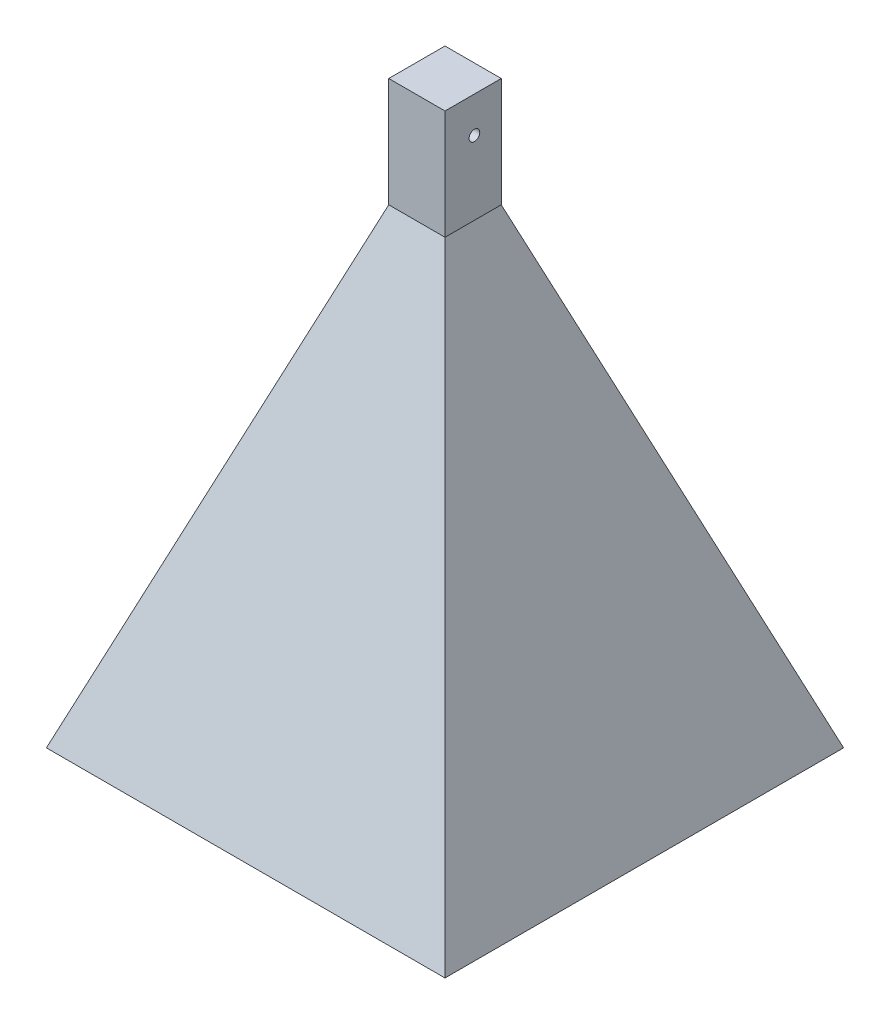
ISO-10303-21;
HEADER;
FILE_DESCRIPTION(('STEP AP214'),'2;1');
FILE_NAME('part.step','',(''),(''),'','','');
FILE_SCHEMA(('AUTOMOTIVE_DESIGN { 1 0 10303 214 1 1 1 1 }'));
ENDSEC;
DATA;
#1=APPLICATION_CONTEXT('core data for automotive mechanical design processes');
#2=APPLICATION_PROTOCOL_DEFINITION('international standard','automotive_design',2000,#1);
#3=PRODUCT_CONTEXT('',#1,'mechanical');
#4=PRODUCT('Part','Part','',(#3));
#5=PRODUCT_RELATED_PRODUCT_CATEGORY('part','',(#4));
#6=PRODUCT_DEFINITION_FORMATION('','',#4);
#7=PRODUCT_DEFINITION_CONTEXT('part definition',#1,'design');
#8=PRODUCT_DEFINITION('design','',#6,#7);
#9=PRODUCT_DEFINITION_SHAPE('','',#8);
#10=(LENGTH_UNIT() NAMED_UNIT(*) SI_UNIT(.MILLI.,.METRE.));
#11=(NAMED_UNIT(*) PLANE_ANGLE_UNIT() SI_UNIT($,.RADIAN.));
#12=(NAMED_UNIT(*) SI_UNIT($,.STERADIAN.) SOLID_ANGLE_UNIT());
#13=UNCERTAINTY_MEASURE_WITH_UNIT(LENGTH_MEASURE(1.E-05),#10,'distance_accuracy_value','');
#14=(GEOMETRIC_REPRESENTATION_CONTEXT(3) GLOBAL_UNCERTAINTY_ASSIGNED_CONTEXT((#13)) GLOBAL_UNIT_ASSIGNED_CONTEXT((#10,
#11,#12)) REPRESENTATION_CONTEXT('',''));
#15=CARTESIAN_POINT('',(0.,0.,0.));
#16=DIRECTION('',(0.,0.,1.));
#17=DIRECTION('',(1.,0.,0.));
#18=AXIS2_PLACEMENT_3D('',#15,#16,#17);
#19=CARTESIAN_POINT('',(-52.5,-500000.,52.5));
#20=DIRECTION('',(0.,0.,1.));
#21=DIRECTION('',(1.,0.,0.));
#22=AXIS2_PLACEMENT_3D('',#19,#20,#21);
#23=PLANE('',#22);
#24=DIRECTION('',(0.,1.,0.));
#25=VECTOR('',#24,1.);
#26=CARTESIAN_POINT('',(-52.5,-500000.,52.5));
#27=LINE('',#26,#25);
#28=CARTESIAN_POINT('',(-52.4999999999999,877.81903551575,52.5));
#29=VERTEX_POINT('',#28);
#30=CARTESIAN_POINT('',(-52.5,1082.,52.5));
#31=VERTEX_POINT('',#30);
#32=EDGE_CURVE('E70',#29,#31,#27,.T.);
#33=ORIENTED_EDGE('',*,*,#32,.F.);
#34=DIRECTION('',(-1.,0.,0.));
#35=VECTOR('',#34,1.);
#36=CARTESIAN_POINT('',(-52.5,877.819035515756,52.5));
#37=LINE('',#36,#35);
#38=CARTESIAN_POINT('',(52.5,877.819035515756,52.5));
#39=VERTEX_POINT('',#38);
#40=EDGE_CURVE('E216',#29,#39,#37,.F.);
#41=ORIENTED_EDGE('',*,*,#40,.T.);
#42=DIRECTION('',(0.,1.,0.));
#43=VECTOR('',#42,1.);
#44=CARTESIAN_POINT('',(52.5,-500000.,52.5));
#45=LINE('',#44,#43);
#46=CARTESIAN_POINT('',(52.5,1082.,52.5));
#47=VERTEX_POINT('',#46);
#48=EDGE_CURVE('E224',#39,#47,#45,.T.);
#49=ORIENTED_EDGE('',*,*,#48,.T.);
#50=DIRECTION('',(1.,0.,0.));
#51=VECTOR('',#50,1.);
#52=CARTESIAN_POINT('',(-52.5,1082.,52.5));
#53=LINE('',#52,#51);
#54=EDGE_CURVE('E208',#31,#47,#53,.T.);
#55=ORIENTED_EDGE('',*,*,#54,.F.);
#56=EDGE_LOOP('',(#33,#41,#49,#55));
#57=FACE_BOUND('',#56,.T.);
#58=ADVANCED_FACE('F45',(#57),#23,.T.);
#59=CARTESIAN_POINT('',(-52.5,-500000.,52.5));
#60=DIRECTION('',(-1.,0.,0.));
#61=DIRECTION('',(0.,0.,1.));
#62=AXIS2_PLACEMENT_3D('',#59,#60,#61);
#63=PLANE('',#62);
#64=DIRECTION('',(0.,1.,0.));
#65=VECTOR('',#64,1.);
#66=CARTESIAN_POINT('',(-52.5,-500000.,-52.5));
#67=LINE('',#66,#65);
#68=CARTESIAN_POINT('',(-52.5,877.819035515756,-52.5));
#69=VERTEX_POINT('',#68);
#70=CARTESIAN_POINT('',(-52.5,1082.,-52.5));
#71=VERTEX_POINT('',#70);
#72=EDGE_CURVE('E221',#69,#71,#67,.T.);
#73=ORIENTED_EDGE('',*,*,#72,.F.);
#74=DIRECTION('',(0.,0.,-1.));
#75=VECTOR('',#74,1.);
#76=CARTESIAN_POINT('',(-52.5,877.819035515756,52.5));
#77=LINE('',#76,#75);
#78=EDGE_CURVE('E215',#69,#29,#77,.F.);
#79=ORIENTED_EDGE('',*,*,#78,.T.);
#80=ORIENTED_EDGE('',*,*,#32,.T.);
#81=DIRECTION('',(0.,0.,1.));
#82=VECTOR('',#81,1.);
#83=CARTESIAN_POINT('',(-52.5,1082.,52.5));
#84=LINE('',#83,#82);
#85=EDGE_CURVE('E205',#71,#31,#84,.T.);
#86=ORIENTED_EDGE('',*,*,#85,.F.);
#87=EDGE_LOOP('',(#73,#79,#80,#86));
#88=FACE_BOUND('',#87,.T.);
#89=ADVANCED_FACE('F285',(#88),#63,.T.);
#90=CARTESIAN_POINT('',(-52.5,-500000.,-52.5));
#91=DIRECTION('',(0.,0.,-1.));
#92=DIRECTION('',(-1.,0.,0.));
#93=AXIS2_PLACEMENT_3D('',#90,#91,#92);
#94=PLANE('',#93);
#95=DIRECTION('',(0.,1.,0.));
#96=VECTOR('',#95,1.);
#97=CARTESIAN_POINT('',(52.5,-500000.,-52.5));
#98=LINE('',#97,#96);
#99=CARTESIAN_POINT('',(52.5,877.819035515756,-52.5));
#100=VERTEX_POINT('',#99);
#101=CARTESIAN_POINT('',(52.5,1082.,-52.5));
#102=VERTEX_POINT('',#101);
#103=EDGE_CURVE('E218',#100,#102,#98,.T.);
#104=ORIENTED_EDGE('',*,*,#103,.F.);
#105=DIRECTION('',(1.,0.,0.));
#106=VECTOR('',#105,1.);
#107=CARTESIAN_POINT('',(-52.5,877.819035515756,-52.5));
#108=LINE('',#107,#106);
#109=EDGE_CURVE('E213',#100,#69,#108,.F.);
#110=ORIENTED_EDGE('',*,*,#109,.T.);
#111=ORIENTED_EDGE('',*,*,#72,.T.);
#112=DIRECTION('',(-1.,0.,0.));
#113=VECTOR('',#112,1.);
#114=CARTESIAN_POINT('',(-52.5,1082.,-52.5));
#115=LINE('',#114,#113);
#116=EDGE_CURVE('E202',#102,#71,#115,.T.);
#117=ORIENTED_EDGE('',*,*,#116,.F.);
#118=EDGE_LOOP('',(#104,#110,#111,#117));
#119=FACE_BOUND('',#118,.T.);
#120=ADVANCED_FACE('F279',(#119),#94,.T.);
#121=CARTESIAN_POINT('',(52.5,-500000.,52.5));
#122=DIRECTION('',(1.,0.,0.));
#123=DIRECTION('',(0.,0.,-1.));
#124=AXIS2_PLACEMENT_3D('',#121,#122,#123);
#125=PLANE('',#124);
#126=CARTESIAN_POINT('',(52.5,1015.,-2.39055159684673));
#127=DIRECTION('',(1.,0.,0.));
#128=DIRECTION('',(0.,0.,-1.));
#129=AXIS2_PLACEMENT_3D('',#126,#127,#128);
#130=CIRCLE('',#129,10.);
#131=CARTESIAN_POINT('',(52.5,1015.,-12.3905515968467));
#132=VERTEX_POINT('',#131);
#133=EDGE_CURVE('E163',#132,#132,#130,.T.);
#134=ORIENTED_EDGE('',*,*,#133,.F.);
#135=EDGE_LOOP('',(#134));
#136=FACE_BOUND('',#135,.T.);
#137=ORIENTED_EDGE('',*,*,#48,.F.);
#138=DIRECTION('',(0.,0.,1.));
#139=VECTOR('',#138,1.);
#140=CARTESIAN_POINT('',(52.5,877.819035515756,52.5));
#141=LINE('',#140,#139);
#142=EDGE_CURVE('E211',#39,#100,#141,.F.);
#143=ORIENTED_EDGE('',*,*,#142,.T.);
#144=ORIENTED_EDGE('',*,*,#103,.T.);
#145=DIRECTION('',(0.,0.,-1.));
#146=VECTOR('',#145,1.);
#147=CARTESIAN_POINT('',(52.5,1082.,52.5));
#148=LINE('',#147,#146);
#149=EDGE_CURVE('E186',#47,#102,#148,.T.);
#150=ORIENTED_EDGE('',*,*,#149,.F.);
#151=EDGE_LOOP('',(#137,#143,#144,#150));
#152=FACE_BOUND('',#151,.T.);
#153=ADVANCED_FACE('F263',(#136,#152),#125,.T.);
#154=CARTESIAN_POINT('',(0.,1082.,0.));
#155=DIRECTION('',(0.,-1.,0.));
#156=DIRECTION('',(0.,0.,-1.));
#157=AXIS2_PLACEMENT_3D('',#154,#155,#156);
#158=PLANE('',#157);
#159=ORIENTED_EDGE('',*,*,#149,.T.);
#160=ORIENTED_EDGE('',*,*,#116,.T.);
#161=ORIENTED_EDGE('',*,*,#85,.T.);
#162=ORIENTED_EDGE('',*,*,#54,.T.);
#163=EDGE_LOOP('',(#159,#160,#161,#162));
#164=FACE_BOUND('',#163,.T.);
#165=ADVANCED_FACE('F268',(#164),#158,.F.);
#166=CARTESIAN_POINT('',(372.,0.,372.));
#167=DIRECTION('',(0.939692620785908,0.342020143325669,0.));
#168=DIRECTION('',(-0.342020143325669,0.939692620785908,0.));
#169=AXIS2_PLACEMENT_3D('',#166,#167,#168);
#170=PLANE('',#169);
#171=DIRECTION('',(0.323615577118185,-0.889126490715988,-0.323615577118185));
#172=VECTOR('',#171,1.);
#173=CARTESIAN_POINT('',(294.083080935369,214.074975723546,-294.083080935369));
#174=LINE('',#173,#172);
#175=CARTESIAN_POINT('',(372.,0.,-372.));
#176=VERTEX_POINT('',#175);
#177=EDGE_CURVE('E13',#100,#176,#174,.T.);
#178=ORIENTED_EDGE('',*,*,#177,.F.);
#179=ORIENTED_EDGE('',*,*,#142,.F.);
#180=DIRECTION('',(0.323615577118185,-0.889126490715988,0.323615577118185));
#181=VECTOR('',#180,1.);
#182=CARTESIAN_POINT('',(372.,0.,372.));
#183=LINE('',#182,#181);
#184=CARTESIAN_POINT('',(372.,0.,372.));
#185=VERTEX_POINT('',#184);
#186=EDGE_CURVE('E237',#39,#185,#183,.T.);
#187=ORIENTED_EDGE('',*,*,#186,.T.);
#188=DIRECTION('',(0.,0.,-1.));
#189=VECTOR('',#188,1.);
#190=CARTESIAN_POINT('',(372.,0.,372.));
#191=LINE('',#190,#189);
#192=EDGE_CURVE('E226',#185,#176,#191,.T.);
#193=ORIENTED_EDGE('',*,*,#192,.T.);
#194=EDGE_LOOP('',(#178,#179,#187,#193));
#195=FACE_BOUND('',#194,.T.);
#196=ADVANCED_FACE('F266',(#195),#170,.T.);
#197=CARTESIAN_POINT('',(-372.,0.,-372.));
#198=DIRECTION('',(0.,0.342020143325669,-0.939692620785908));
#199=DIRECTION('',(0.,0.939692620785908,0.342020143325669));
#200=AXIS2_PLACEMENT_3D('',#197,#198,#199);
#201=PLANE('',#200);
#202=DIRECTION('',(-0.323615577118185,-0.889126490715988,-0.323615577118185));
#203=VECTOR('',#202,1.);
#204=CARTESIAN_POINT('',(-294.083080935369,214.074975723546,-294.083080935369));
#205=LINE('',#204,#203);
#206=CARTESIAN_POINT('',(-372.,0.,-372.));
#207=VERTEX_POINT('',#206);
#208=EDGE_CURVE('E54',#69,#207,#205,.T.);
#209=ORIENTED_EDGE('',*,*,#208,.F.);
#210=ORIENTED_EDGE('',*,*,#109,.F.);
#211=ORIENTED_EDGE('',*,*,#177,.T.);
#212=DIRECTION('',(-1.,0.,0.));
#213=VECTOR('',#212,1.);
#214=CARTESIAN_POINT('',(-372.,0.,-372.));
#215=LINE('',#214,#213);
#216=EDGE_CURVE('E229',#176,#207,#215,.T.);
#217=ORIENTED_EDGE('',*,*,#216,.T.);
#218=EDGE_LOOP('',(#209,#210,#211,#217));
#219=FACE_BOUND('',#218,.T.);
#220=ADVANCED_FACE('F47',(#219),#201,.T.);
#221=CARTESIAN_POINT('',(-372.,0.,372.));
#222=DIRECTION('',(-0.939692620785908,0.342020143325669,0.));
#223=DIRECTION('',(-0.342020143325669,-0.939692620785908,0.));
#224=AXIS2_PLACEMENT_3D('',#221,#222,#223);
#225=PLANE('',#224);
#226=DIRECTION('',(-0.323615577118185,-0.889126490715988,0.323615577118185));
#227=VECTOR('',#226,1.);
#228=CARTESIAN_POINT('',(-372.,0.,372.));
#229=LINE('',#228,#227);
#230=CARTESIAN_POINT('',(-372.,0.,372.));
#231=VERTEX_POINT('',#230);
#232=EDGE_CURVE('E240',#29,#231,#229,.T.);
#233=ORIENTED_EDGE('',*,*,#232,.F.);
#234=ORIENTED_EDGE('',*,*,#78,.F.);
#235=ORIENTED_EDGE('',*,*,#208,.T.);
#236=DIRECTION('',(0.,0.,1.));
#237=VECTOR('',#236,1.);
#238=CARTESIAN_POINT('',(-372.,0.,372.));
#239=LINE('',#238,#237);
#240=EDGE_CURVE('E232',#207,#231,#239,.T.);
#241=ORIENTED_EDGE('',*,*,#240,.T.);
#242=EDGE_LOOP('',(#233,#234,#235,#241));
#243=FACE_BOUND('',#242,.T.);
#244=ADVANCED_FACE('F245',(#243),#225,.T.);
#245=CARTESIAN_POINT('',(-372.,0.,372.));
#246=DIRECTION('',(0.,0.342020143325669,0.939692620785908));
#247=DIRECTION('',(0.,-0.939692620785908,0.342020143325669));
#248=AXIS2_PLACEMENT_3D('',#245,#246,#247);
#249=PLANE('',#248);
#250=ORIENTED_EDGE('',*,*,#186,.F.);
#251=ORIENTED_EDGE('',*,*,#40,.F.);
#252=ORIENTED_EDGE('',*,*,#232,.T.);
#253=DIRECTION('',(1.,0.,0.));
#254=VECTOR('',#253,1.);
#255=CARTESIAN_POINT('',(-372.,0.,372.));
#256=LINE('',#255,#254);
#257=EDGE_CURVE('E235',#231,#185,#256,.T.);
#258=ORIENTED_EDGE('',*,*,#257,.T.);
#259=EDGE_LOOP('',(#250,#251,#252,#258));
#260=FACE_BOUND('',#259,.T.);
#261=ADVANCED_FACE('F257',(#260),#249,.T.);
#262=CARTESIAN_POINT('',(0.,0.,0.));
#263=DIRECTION('',(0.,-1.,0.));
#264=DIRECTION('',(0.,0.,-1.));
#265=AXIS2_PLACEMENT_3D('',#262,#263,#264);
#266=PLANE('',#265);
#267=DIRECTION('',(1.,0.,0.));
#268=VECTOR('',#267,1.);
#269=CARTESIAN_POINT('',(-342.,0.,-342.));
#270=LINE('',#269,#268);
#271=CARTESIAN_POINT('',(-342.,0.,-342.));
#272=VERTEX_POINT('',#271);
#273=CARTESIAN_POINT('',(342.,0.,-342.));
#274=VERTEX_POINT('',#273);
#275=EDGE_CURVE('E62',#272,#274,#270,.T.);
#276=ORIENTED_EDGE('',*,*,#275,.F.);
#277=DIRECTION('',(0.,0.,-1.));
#278=VECTOR('',#277,1.);
#279=CARTESIAN_POINT('',(-342.,0.,342.));
#280=LINE('',#279,#278);
#281=CARTESIAN_POINT('',(-342.,0.,342.));
#282=VERTEX_POINT('',#281);
#283=EDGE_CURVE('E180',#282,#272,#280,.T.);
#284=ORIENTED_EDGE('',*,*,#283,.F.);
#285=DIRECTION('',(-1.,0.,0.));
#286=VECTOR('',#285,1.);
#287=CARTESIAN_POINT('',(342.,0.,342.));
#288=LINE('',#287,#286);
#289=CARTESIAN_POINT('',(342.,0.,342.));
#290=VERTEX_POINT('',#289);
#291=EDGE_CURVE('E177',#290,#282,#288,.T.);
#292=ORIENTED_EDGE('',*,*,#291,.F.);
#293=DIRECTION('',(0.,0.,1.));
#294=VECTOR('',#293,1.);
#295=CARTESIAN_POINT('',(342.,0.,-342.));
#296=LINE('',#295,#294);
#297=EDGE_CURVE('E174',#274,#290,#296,.T.);
#298=ORIENTED_EDGE('',*,*,#297,.F.);
#299=EDGE_LOOP('',(#276,#284,#292,#298));
#300=FACE_BOUND('',#299,.T.);
#301=ORIENTED_EDGE('',*,*,#192,.F.);
#302=ORIENTED_EDGE('',*,*,#257,.F.);
#303=ORIENTED_EDGE('',*,*,#240,.F.);
#304=ORIENTED_EDGE('',*,*,#216,.F.);
#305=EDGE_LOOP('',(#301,#302,#303,#304));
#306=FACE_BOUND('',#305,.T.);
#307=ADVANCED_FACE('F254',(#300,#306),#266,.T.);
#308=CARTESIAN_POINT('',(-342.,0.,-342.));
#309=DIRECTION('',(0.,0.342020143325669,-0.939692620785908));
#310=DIRECTION('',(0.,0.939692620785908,0.342020143325669));
#311=AXIS2_PLACEMENT_3D('',#308,#309,#310);
#312=PLANE('',#311);
#313=ORIENTED_EDGE('',*,*,#275,.T.);
#314=DIRECTION('',(0.323615577118185,-0.889126490715988,-0.323615577118185));
#315=VECTOR('',#314,1.);
#316=CARTESIAN_POINT('',(270.366703440581,196.810864778099,-270.366703440581));
#317=LINE('',#316,#315);
#318=CARTESIAN_POINT('',(24.981925954137,871.,-24.981925954137));
#319=VERTEX_POINT('',#318);
#320=EDGE_CURVE('E188',#319,#274,#317,.T.);
#321=ORIENTED_EDGE('',*,*,#320,.F.);
#322=DIRECTION('',(1.,0.,0.));
#323=VECTOR('',#322,1.);
#324=CARTESIAN_POINT('',(0.,871.,-24.9819259541369));
#325=LINE('',#324,#323);
#326=CARTESIAN_POINT('',(-24.9819259541368,871.,-24.981925954137));
#327=VERTEX_POINT('',#326);
#328=EDGE_CURVE('E183',#327,#319,#325,.T.);
#329=ORIENTED_EDGE('',*,*,#328,.F.);
#330=DIRECTION('',(-0.323615577118185,-0.889126490715988,-0.323615577118185));
#331=VECTOR('',#330,1.);
#332=CARTESIAN_POINT('',(-270.366703440581,196.810864778099,-270.366703440581));
#333=LINE('',#332,#331);
#334=EDGE_CURVE('E184',#327,#272,#333,.T.);
#335=ORIENTED_EDGE('',*,*,#334,.T.);
#336=EDGE_LOOP('',(#313,#321,#329,#335));
#337=FACE_BOUND('',#336,.T.);
#338=ADVANCED_FACE('F296',(#337),#312,.F.);
#339=CARTESIAN_POINT('',(-342.,0.,342.));
#340=DIRECTION('',(-0.939692620785908,0.342020143325669,0.));
#341=DIRECTION('',(-0.342020143325669,-0.939692620785908,0.));
#342=AXIS2_PLACEMENT_3D('',#339,#340,#341);
#343=PLANE('',#342);
#344=ORIENTED_EDGE('',*,*,#283,.T.);
#345=ORIENTED_EDGE('',*,*,#334,.F.);
#346=DIRECTION('',(0.,0.,-1.));
#347=VECTOR('',#346,1.);
#348=CARTESIAN_POINT('',(-24.9819259541368,871.,0.));
#349=LINE('',#348,#347);
#350=CARTESIAN_POINT('',(-24.9819259541368,871.,24.981925954137));
#351=VERTEX_POINT('',#350);
#352=EDGE_CURVE('E144',#351,#327,#349,.T.);
#353=ORIENTED_EDGE('',*,*,#352,.F.);
#354=DIRECTION('',(-0.323615577118185,-0.889126490715988,0.323615577118185));
#355=VECTOR('',#354,1.);
#356=CARTESIAN_POINT('',(-270.366703440581,196.810864778099,270.366703440581));
#357=LINE('',#356,#355);
#358=EDGE_CURVE('E187',#351,#282,#357,.T.);
#359=ORIENTED_EDGE('',*,*,#358,.T.);
#360=EDGE_LOOP('',(#344,#345,#353,#359));
#361=FACE_BOUND('',#360,.T.);
#362=ADVANCED_FACE('F302',(#361),#343,.F.);
#363=CARTESIAN_POINT('',(342.,0.,342.));
#364=DIRECTION('',(0.,0.342020143325669,0.939692620785908));
#365=DIRECTION('',(0.,-0.939692620785908,0.342020143325669));
#366=AXIS2_PLACEMENT_3D('',#363,#364,#365);
#367=PLANE('',#366);
#368=ORIENTED_EDGE('',*,*,#291,.T.);
#369=ORIENTED_EDGE('',*,*,#358,.F.);
#370=DIRECTION('',(-1.,0.,0.));
#371=VECTOR('',#370,1.);
#372=CARTESIAN_POINT('',(0.,871.,24.9819259541369));
#373=LINE('',#372,#371);
#374=CARTESIAN_POINT('',(24.981925954137,871.,24.981925954137));
#375=VERTEX_POINT('',#374);
#376=EDGE_CURVE('E196',#375,#351,#373,.T.);
#377=ORIENTED_EDGE('',*,*,#376,.F.);
#378=DIRECTION('',(0.323615577118185,-0.889126490715988,0.323615577118185));
#379=VECTOR('',#378,1.);
#380=CARTESIAN_POINT('',(270.366703440581,196.810864778099,270.366703440581));
#381=LINE('',#380,#379);
#382=EDGE_CURVE('E190',#375,#290,#381,.T.);
#383=ORIENTED_EDGE('',*,*,#382,.T.);
#384=EDGE_LOOP('',(#368,#369,#377,#383));
#385=FACE_BOUND('',#384,.T.);
#386=ADVANCED_FACE('F316',(#385),#367,.F.);
#387=CARTESIAN_POINT('',(342.,0.,-342.));
#388=DIRECTION('',(0.939692620785908,0.342020143325669,0.));
#389=DIRECTION('',(-0.342020143325669,0.939692620785908,0.));
#390=AXIS2_PLACEMENT_3D('',#387,#388,#389);
#391=PLANE('',#390);
#392=ORIENTED_EDGE('',*,*,#297,.T.);
#393=ORIENTED_EDGE('',*,*,#382,.F.);
#394=DIRECTION('',(0.,0.,1.));
#395=VECTOR('',#394,1.);
#396=CARTESIAN_POINT('',(24.9819259541369,871.,0.));
#397=LINE('',#396,#395);
#398=EDGE_CURVE('E194',#319,#375,#397,.T.);
#399=ORIENTED_EDGE('',*,*,#398,.F.);
#400=ORIENTED_EDGE('',*,*,#320,.T.);
#401=EDGE_LOOP('',(#392,#393,#399,#400));
#402=FACE_BOUND('',#401,.T.);
#403=ADVANCED_FACE('F309',(#402),#391,.F.);
#404=CARTESIAN_POINT('',(-24.9819259541368,1072.,24.981925954137));
#405=DIRECTION('',(-1.,0.,0.));
#406=DIRECTION('',(0.,0.,1.));
#407=AXIS2_PLACEMENT_3D('',#404,#405,#406);
#408=PLANE('',#407);
#409=ORIENTED_EDGE('',*,*,#352,.T.);
#410=DIRECTION('',(0.,-1.,0.));
#411=VECTOR('',#410,1.);
#412=CARTESIAN_POINT('',(-24.9819259541368,1072.,-24.981925954137));
#413=LINE('',#412,#411);
#414=CARTESIAN_POINT('',(-24.9819259541368,1072.,-24.981925954137));
#415=VERTEX_POINT('',#414);
#416=EDGE_CURVE('E136',#415,#327,#413,.T.);
#417=ORIENTED_EDGE('',*,*,#416,.F.);
#418=DIRECTION('',(0.,0.,-1.));
#419=VECTOR('',#418,1.);
#420=CARTESIAN_POINT('',(-24.9819259541368,1072.,24.981925954137));
#421=LINE('',#420,#419);
#422=CARTESIAN_POINT('',(-24.9819259541368,1072.,24.981925954137));
#423=VERTEX_POINT('',#422);
#424=EDGE_CURVE('E141',#423,#415,#421,.T.);
#425=ORIENTED_EDGE('',*,*,#424,.F.);
#426=DIRECTION('',(0.,-1.,0.));
#427=VECTOR('',#426,1.);
#428=CARTESIAN_POINT('',(-24.9819259541368,1072.,24.981925954137));
#429=LINE('',#428,#427);
#430=EDGE_CURVE('E168',#423,#351,#429,.T.);
#431=ORIENTED_EDGE('',*,*,#430,.T.);
#432=EDGE_LOOP('',(#409,#417,#425,#431));
#433=FACE_BOUND('',#432,.T.);
#434=ADVANCED_FACE('F138',(#433),#408,.F.);
#435=CARTESIAN_POINT('',(24.981925954137,1072.,24.981925954137));
#436=DIRECTION('',(0.,0.,1.));
#437=DIRECTION('',(1.,0.,0.));
#438=AXIS2_PLACEMENT_3D('',#435,#436,#437);
#439=PLANE('',#438);
#440=ORIENTED_EDGE('',*,*,#376,.T.);
#441=ORIENTED_EDGE('',*,*,#430,.F.);
#442=DIRECTION('',(-1.,0.,0.));
#443=VECTOR('',#442,1.);
#444=CARTESIAN_POINT('',(24.981925954137,1072.,24.981925954137));
#445=LINE('',#444,#443);
#446=CARTESIAN_POINT('',(24.981925954137,1072.,24.981925954137));
#447=VERTEX_POINT('',#446);
#448=EDGE_CURVE('E149',#447,#423,#445,.T.);
#449=ORIENTED_EDGE('',*,*,#448,.F.);
#450=DIRECTION('',(0.,-1.,0.));
#451=VECTOR('',#450,1.);
#452=CARTESIAN_POINT('',(24.981925954137,1072.,24.981925954137));
#453=LINE('',#452,#451);
#454=EDGE_CURVE('E170',#447,#375,#453,.T.);
#455=ORIENTED_EDGE('',*,*,#454,.T.);
#456=EDGE_LOOP('',(#440,#441,#449,#455));
#457=FACE_BOUND('',#456,.T.);
#458=ADVANCED_FACE('F318',(#457),#439,.F.);
#459=CARTESIAN_POINT('',(24.981925954137,1072.,-24.981925954137));
#460=DIRECTION('',(1.,0.,0.));
#461=DIRECTION('',(0.,0.,-1.));
#462=AXIS2_PLACEMENT_3D('',#459,#460,#461);
#463=PLANE('',#462);
#464=CARTESIAN_POINT('',(24.981925954137,1015.,-2.39055159684673));
#465=DIRECTION('',(1.,0.,0.));
#466=DIRECTION('',(0.,0.,-1.));
#467=AXIS2_PLACEMENT_3D('',#464,#465,#466);
#468=CIRCLE('',#467,10.);
#469=CARTESIAN_POINT('',(24.981925954137,1015.,-12.3905515968467));
#470=VERTEX_POINT('',#469);
#471=EDGE_CURVE('E49',#470,#470,#468,.T.);
#472=ORIENTED_EDGE('',*,*,#471,.T.);
#473=EDGE_LOOP('',(#472));
#474=FACE_BOUND('',#473,.T.);
#475=ORIENTED_EDGE('',*,*,#398,.T.);
#476=ORIENTED_EDGE('',*,*,#454,.F.);
#477=DIRECTION('',(0.,0.,1.));
#478=VECTOR('',#477,1.);
#479=CARTESIAN_POINT('',(24.981925954137,1072.,-24.981925954137));
#480=LINE('',#479,#478);
#481=CARTESIAN_POINT('',(24.981925954137,1072.,-24.981925954137));
#482=VERTEX_POINT('',#481);
#483=EDGE_CURVE('E157',#482,#447,#480,.T.);
#484=ORIENTED_EDGE('',*,*,#483,.F.);
#485=DIRECTION('',(0.,-1.,0.));
#486=VECTOR('',#485,1.);
#487=CARTESIAN_POINT('',(24.981925954137,1072.,-24.981925954137));
#488=LINE('',#487,#486);
#489=EDGE_CURVE('E148',#482,#319,#488,.T.);
#490=ORIENTED_EDGE('',*,*,#489,.T.);
#491=EDGE_LOOP('',(#475,#476,#484,#490));
#492=FACE_BOUND('',#491,.T.);
#493=ADVANCED_FACE('F320',(#474,#492),#463,.F.);
#494=CARTESIAN_POINT('',(-24.9819259541368,1072.,-24.981925954137));
#495=DIRECTION('',(0.,0.,-1.));
#496=DIRECTION('',(-1.,0.,0.));
#497=AXIS2_PLACEMENT_3D('',#494,#495,#496);
#498=PLANE('',#497);
#499=ORIENTED_EDGE('',*,*,#328,.T.);
#500=ORIENTED_EDGE('',*,*,#489,.F.);
#501=DIRECTION('',(1.,0.,0.));
#502=VECTOR('',#501,1.);
#503=CARTESIAN_POINT('',(-24.9819259541368,1072.,-24.981925954137));
#504=LINE('',#503,#502);
#505=EDGE_CURVE('E152',#415,#482,#504,.T.);
#506=ORIENTED_EDGE('',*,*,#505,.F.);
#507=ORIENTED_EDGE('',*,*,#416,.T.);
#508=EDGE_LOOP('',(#499,#500,#506,#507));
#509=FACE_BOUND('',#508,.T.);
#510=ADVANCED_FACE('F153',(#509),#498,.F.);
#511=CARTESIAN_POINT('',(0.,1072.,0.));
#512=DIRECTION('',(0.,-1.,0.));
#513=DIRECTION('',(0.,0.,-1.));
#514=AXIS2_PLACEMENT_3D('',#511,#512,#513);
#515=PLANE('',#514);
#516=ORIENTED_EDGE('',*,*,#424,.T.);
#517=ORIENTED_EDGE('',*,*,#505,.T.);
#518=ORIENTED_EDGE('',*,*,#483,.T.);
#519=ORIENTED_EDGE('',*,*,#448,.T.);
#520=EDGE_LOOP('',(#516,#517,#518,#519));
#521=FACE_BOUND('',#520,.T.);
#522=ADVANCED_FACE('F159',(#521),#515,.T.);
#523=CARTESIAN_POINT('',(-17.4999999999999,1015.,-2.39055159684673));
#524=DIRECTION('',(1.,0.,0.));
#525=DIRECTION('',(0.,0.,-1.));
#526=AXIS2_PLACEMENT_3D('',#523,#524,#525);
#527=CYLINDRICAL_SURFACE('',#526,10.);
#528=ORIENTED_EDGE('',*,*,#133,.T.);
#529=EDGE_LOOP('',(#528));
#530=FACE_BOUND('',#529,.T.);
#531=ORIENTED_EDGE('',*,*,#471,.F.);
#532=EDGE_LOOP('',(#531));
#533=FACE_BOUND('',#532,.T.);
#534=ADVANCED_FACE('F373',(#530,#533),#527,.F.);
#535=CLOSED_SHELL('',(#58,#89,#120,#153,#165,#196,#220,#244,#261,#307,#338,#362,#386,#403,#434,
#458,#493,#510,#522,#534));
#536=MANIFOLD_SOLID_BREP('B2',#535);
#537=ADVANCED_BREP_SHAPE_REPRESENTATION('',(#18,#536),#14);
#538=SHAPE_DEFINITION_REPRESENTATION(#9,#537);
ENDSEC;
END-ISO-10303-21;
